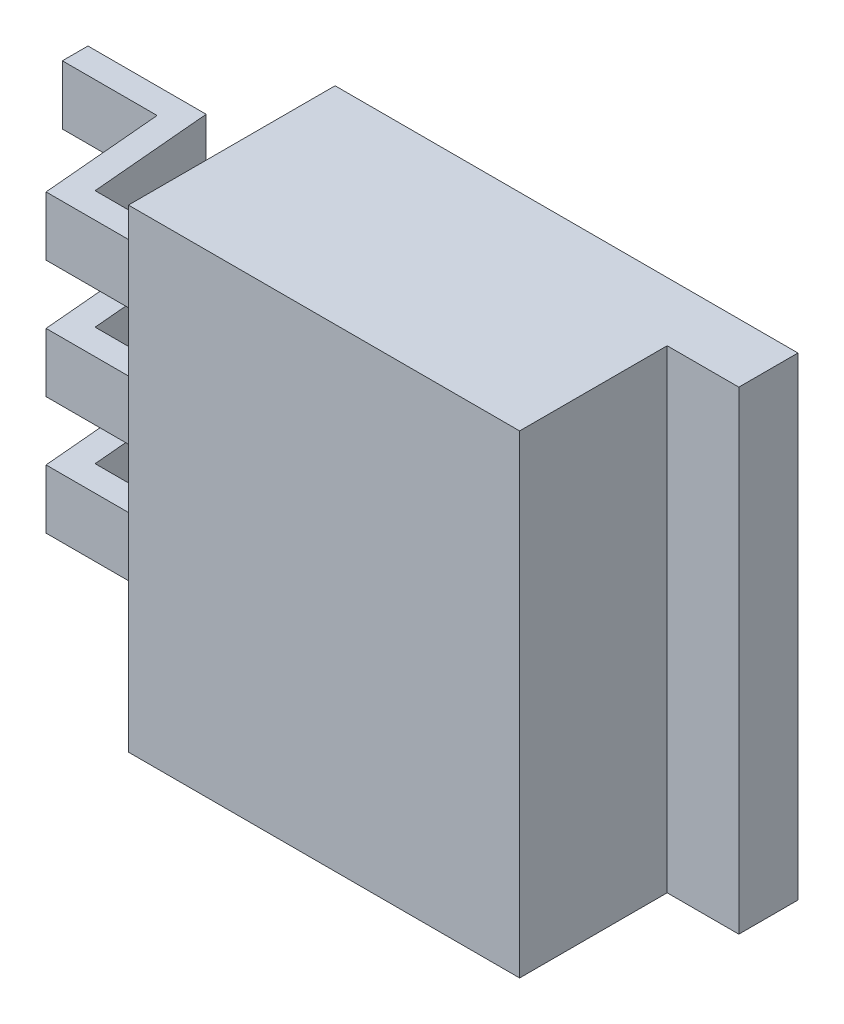
ISO-10303-21;
HEADER;
FILE_DESCRIPTION(('STEP AP214'),'2;1');
FILE_NAME('part.step','',(''),(''),'','','');
FILE_SCHEMA(('AUTOMOTIVE_DESIGN { 1 0 10303 214 1 1 1 1 }'));
ENDSEC;
DATA;
#1=APPLICATION_CONTEXT('core data for automotive mechanical design processes');
#2=APPLICATION_PROTOCOL_DEFINITION('international standard','automotive_design',2000,#1);
#3=PRODUCT_CONTEXT('',#1,'mechanical');
#4=PRODUCT('Part','Part','',(#3));
#5=PRODUCT_RELATED_PRODUCT_CATEGORY('part','',(#4));
#6=PRODUCT_DEFINITION_FORMATION('','',#4);
#7=PRODUCT_DEFINITION_CONTEXT('part definition',#1,'design');
#8=PRODUCT_DEFINITION('design','',#6,#7);
#9=PRODUCT_DEFINITION_SHAPE('','',#8);
#10=(LENGTH_UNIT() NAMED_UNIT(*) SI_UNIT(.MILLI.,.METRE.));
#11=(NAMED_UNIT(*) PLANE_ANGLE_UNIT() SI_UNIT($,.RADIAN.));
#12=(NAMED_UNIT(*) SI_UNIT($,.STERADIAN.) SOLID_ANGLE_UNIT());
#13=UNCERTAINTY_MEASURE_WITH_UNIT(LENGTH_MEASURE(1.E-05),#10,'distance_accuracy_value','');
#14=(GEOMETRIC_REPRESENTATION_CONTEXT(3) GLOBAL_UNCERTAINTY_ASSIGNED_CONTEXT((#13)) GLOBAL_UNIT_ASSIGNED_CONTEXT((#10,
#11,#12)) REPRESENTATION_CONTEXT('',''));
#15=CARTESIAN_POINT('',(0.,0.,0.));
#16=DIRECTION('',(0.,0.,1.));
#17=DIRECTION('',(1.,0.,0.));
#18=AXIS2_PLACEMENT_3D('',#15,#16,#17);
#19=CARTESIAN_POINT('',(-5.358123633487,3.2004,3.2173));
#20=DIRECTION('',(-0.996194698091749,0.,0.0871557427476207));
#21=DIRECTION('',(-0.0871557427476207,0.,-0.996194698091749));
#22=AXIS2_PLACEMENT_3D('',#19,#20,#21);
#23=PLANE('',#22);
#24=DIRECTION('',(-0.0871557427476207,0.,-0.996194698091749));
#25=VECTOR('',#24,1.);
#26=CARTESIAN_POINT('',(-5.358123633487,1.905,3.2173));
#27=LINE('',#26,#25);
#28=CARTESIAN_POINT('',(-5.5914821457098,1.905,0.55));
#29=VERTEX_POINT('',#28);
#30=CARTESIAN_POINT('',(-5.3626992905894,1.905,3.16500000000002));
#31=VERTEX_POINT('',#30);
#32=EDGE_CURVE('E367',#29,#31,#27,.F.);
#33=ORIENTED_EDGE('',*,*,#32,.T.);
#34=DIRECTION('',(0.,1.,0.));
#35=VECTOR('',#34,1.);
#36=CARTESIAN_POINT('',(-5.3626992905894,2.54,3.16500000000004));
#37=LINE('',#36,#35);
#38=CARTESIAN_POINT('',(-5.3626992905894,3.175,3.16500000000002));
#39=VERTEX_POINT('',#38);
#40=EDGE_CURVE('E381',#39,#31,#37,.F.);
#41=ORIENTED_EDGE('',*,*,#40,.F.);
#42=DIRECTION('',(-0.0871557427476207,0.,-0.996194698091749));
#43=VECTOR('',#42,1.);
#44=CARTESIAN_POINT('',(-5.358123633487,3.175,3.2173));
#45=LINE('',#44,#43);
#46=CARTESIAN_POINT('',(-5.5914821457098,3.175,0.55));
#47=VERTEX_POINT('',#46);
#48=EDGE_CURVE('E262',#39,#47,#45,.T.);
#49=ORIENTED_EDGE('',*,*,#48,.T.);
#50=DIRECTION('',(0.,1.,0.));
#51=VECTOR('',#50,1.);
#52=CARTESIAN_POINT('',(-5.59148214571,2.54,0.55));
#53=LINE('',#52,#51);
#54=EDGE_CURVE('E379',#47,#29,#53,.F.);
#55=ORIENTED_EDGE('',*,*,#54,.T.);
#56=EDGE_LOOP('',(#33,#41,#49,#55));
#57=FACE_BOUND('',#56,.T.);
#58=ADVANCED_FACE('F15',(#57),#23,.T.);
#59=CARTESIAN_POINT('',(-5.550761788624,3.2004,0.55));
#60=DIRECTION('',(0.,0.,1.));
#61=DIRECTION('',(-1.,0.,0.));
#62=AXIS2_PLACEMENT_3D('',#59,#60,#61);
#63=PLANE('',#62);
#64=DIRECTION('',(-1.,0.,0.));
#65=VECTOR('',#64,1.);
#66=CARTESIAN_POINT('',(-4.9725,1.905,0.55));
#67=LINE('',#66,#65);
#68=CARTESIAN_POINT('',(-7.6275,1.905,0.55));
#69=VERTEX_POINT('',#68);
#70=EDGE_CURVE('E369',#69,#29,#67,.F.);
#71=ORIENTED_EDGE('',*,*,#70,.T.);
#72=ORIENTED_EDGE('',*,*,#54,.F.);
#73=DIRECTION('',(-1.,0.,0.));
#74=VECTOR('',#73,1.);
#75=CARTESIAN_POINT('',(-4.9725,3.175,0.55));
#76=LINE('',#75,#74);
#77=CARTESIAN_POINT('',(-7.6275,3.175,0.55));
#78=VERTEX_POINT('',#77);
#79=EDGE_CURVE('E259',#47,#78,#76,.T.);
#80=ORIENTED_EDGE('',*,*,#79,.T.);
#81=DIRECTION('',(0.,1.,0.));
#82=VECTOR('',#81,1.);
#83=CARTESIAN_POINT('',(-7.6275,2.54,0.55));
#84=LINE('',#83,#82);
#85=EDGE_CURVE('E422',#78,#69,#84,.F.);
#86=ORIENTED_EDGE('',*,*,#85,.T.);
#87=EDGE_LOOP('',(#71,#72,#80,#86));
#88=FACE_BOUND('',#87,.T.);
#89=ADVANCED_FACE('F766',(#88),#63,.T.);
#90=CARTESIAN_POINT('',(-7.6275,3.2004,0.5726434952249));
#91=DIRECTION('',(-1.,0.,0.));
#92=DIRECTION('',(0.,0.,-1.));
#93=AXIS2_PLACEMENT_3D('',#90,#91,#92);
#94=PLANE('',#93);
#95=DIRECTION('',(0.,0.,-1.));
#96=VECTOR('',#95,1.);
#97=CARTESIAN_POINT('',(-7.6275,1.905,1.5825));
#98=LINE('',#97,#96);
#99=CARTESIAN_POINT('',(-7.6275,1.905,0.));
#100=VERTEX_POINT('',#99);
#101=EDGE_CURVE('E234',#100,#69,#98,.F.);
#102=ORIENTED_EDGE('',*,*,#101,.T.);
#103=ORIENTED_EDGE('',*,*,#85,.F.);
#104=DIRECTION('',(0.,0.,-1.));
#105=VECTOR('',#104,1.);
#106=CARTESIAN_POINT('',(-7.6275,3.175,1.5825));
#107=LINE('',#106,#105);
#108=CARTESIAN_POINT('',(-7.6275,3.175,0.));
#109=VERTEX_POINT('',#108);
#110=EDGE_CURVE('E249',#78,#109,#107,.T.);
#111=ORIENTED_EDGE('',*,*,#110,.T.);
#112=DIRECTION('',(0.,1.,0.));
#113=VECTOR('',#112,1.);
#114=CARTESIAN_POINT('',(-7.6275,2.54,0.));
#115=LINE('',#114,#113);
#116=EDGE_CURVE('E224',#109,#100,#115,.F.);
#117=ORIENTED_EDGE('',*,*,#116,.T.);
#118=EDGE_LOOP('',(#102,#103,#111,#117));
#119=FACE_BOUND('',#118,.T.);
#120=ADVANCED_FACE('F426',(#119),#94,.T.);
#121=CARTESIAN_POINT('',(-7.6783,3.2004,0.));
#122=DIRECTION('',(0.,0.,-1.));
#123=DIRECTION('',(1.,0.,0.));
#124=AXIS2_PLACEMENT_3D('',#121,#122,#123);
#125=PLANE('',#124);
#126=DIRECTION('',(1.,0.,0.));
#127=VECTOR('',#126,1.);
#128=CARTESIAN_POINT('',(-4.9725,1.905,0.));
#129=LINE('',#128,#127);
#130=CARTESIAN_POINT('',(-5.0874999999996,1.905,0.));
#131=VERTEX_POINT('',#130);
#132=EDGE_CURVE('E219',#131,#100,#129,.F.);
#133=ORIENTED_EDGE('',*,*,#132,.T.);
#134=ORIENTED_EDGE('',*,*,#116,.F.);
#135=DIRECTION('',(1.,0.,0.));
#136=VECTOR('',#135,1.);
#137=CARTESIAN_POINT('',(-4.9725,3.175,0.));
#138=LINE('',#137,#136);
#139=CARTESIAN_POINT('',(-5.0874999999996,3.175,0.));
#140=VERTEX_POINT('',#139);
#141=EDGE_CURVE('E221',#109,#140,#138,.T.);
#142=ORIENTED_EDGE('',*,*,#141,.T.);
#143=DIRECTION('',(0.,1.,0.));
#144=VECTOR('',#143,1.);
#145=CARTESIAN_POINT('',(-5.0874999999996,2.54,0.));
#146=LINE('',#145,#144);
#147=EDGE_CURVE('E216',#140,#131,#146,.F.);
#148=ORIENTED_EDGE('',*,*,#147,.T.);
#149=EDGE_LOOP('',(#133,#134,#142,#148));
#150=FACE_BOUND('',#149,.T.);
#151=ADVANCED_FACE('F218',(#150),#125,.T.);
#152=CARTESIAN_POINT('',(-5.092075657102,3.2004,-0.0523));
#153=DIRECTION('',(0.996194698091749,0.,-0.0871557427476207));
#154=DIRECTION('',(0.0871557427476207,0.,0.996194698091749));
#155=AXIS2_PLACEMENT_3D('',#152,#153,#154);
#156=PLANE('',#155);
#157=DIRECTION('',(0.0871557427476207,0.,0.996194698091749));
#158=VECTOR('',#157,1.);
#159=CARTESIAN_POINT('',(-5.092075657102,1.905,-0.0523));
#160=LINE('',#159,#158);
#161=CARTESIAN_POINT('',(-4.8587171448797,1.905,2.615));
#162=VERTEX_POINT('',#161);
#163=EDGE_CURVE('E19',#162,#131,#160,.F.);
#164=ORIENTED_EDGE('',*,*,#163,.T.);
#165=ORIENTED_EDGE('',*,*,#147,.F.);
#166=DIRECTION('',(0.0871557427476207,0.,0.996194698091749));
#167=VECTOR('',#166,1.);
#168=CARTESIAN_POINT('',(-5.092075657102,3.175,-0.0523));
#169=LINE('',#168,#167);
#170=CARTESIAN_POINT('',(-4.8587171448797,3.175,2.615));
#171=VERTEX_POINT('',#170);
#172=EDGE_CURVE('E248',#140,#171,#169,.T.);
#173=ORIENTED_EDGE('',*,*,#172,.T.);
#174=DIRECTION('',(0.,1.,0.));
#175=VECTOR('',#174,1.);
#176=CARTESIAN_POINT('',(-4.85871714488,2.54,2.615));
#177=LINE('',#176,#175);
#178=EDGE_CURVE('E210',#171,#162,#177,.F.);
#179=ORIENTED_EDGE('',*,*,#178,.T.);
#180=EDGE_LOOP('',(#164,#165,#173,#179));
#181=FACE_BOUND('',#180,.T.);
#182=ADVANCED_FACE('F236',(#181),#156,.T.);
#183=CARTESIAN_POINT('',(-4.909541487777,3.2004,2.615));
#184=DIRECTION('',(0.,0.,-1.));
#185=DIRECTION('',(1.,0.,0.));
#186=AXIS2_PLACEMENT_3D('',#183,#184,#185);
#187=PLANE('',#186);
#188=ORIENTED_EDGE('',*,*,#178,.F.);
#189=DIRECTION('',(1.,0.,0.));
#190=VECTOR('',#189,1.);
#191=CARTESIAN_POINT('',(-4.9725,3.175,2.615));
#192=LINE('',#191,#190);
#193=CARTESIAN_POINT('',(-2.3175,3.175,2.615));
#194=VERTEX_POINT('',#193);
#195=EDGE_CURVE('E250',#171,#194,#192,.T.);
#196=ORIENTED_EDGE('',*,*,#195,.T.);
#197=DIRECTION('',(0.,-1.,0.));
#198=VECTOR('',#197,1.);
#199=CARTESIAN_POINT('',(-2.3175,2.54,2.615));
#200=LINE('',#199,#198);
#201=CARTESIAN_POINT('',(-2.3175,1.905,2.615));
#202=VERTEX_POINT('',#201);
#203=EDGE_CURVE('E223',#202,#194,#200,.F.);
#204=ORIENTED_EDGE('',*,*,#203,.F.);
#205=DIRECTION('',(1.,0.,0.));
#206=VECTOR('',#205,1.);
#207=CARTESIAN_POINT('',(-4.9725,1.905,2.615));
#208=LINE('',#207,#206);
#209=EDGE_CURVE('E237',#202,#162,#208,.F.);
#210=ORIENTED_EDGE('',*,*,#209,.T.);
#211=EDGE_LOOP('',(#188,#196,#204,#210));
#212=FACE_BOUND('',#211,.T.);
#213=ADVANCED_FACE('F431',(#212),#187,.T.);
#214=CARTESIAN_POINT('',(-5.358123633487,0.6604,3.2173));
#215=DIRECTION('',(-0.996194698091749,0.,0.0871557427476207));
#216=DIRECTION('',(-0.0871557427476207,0.,-0.996194698091749));
#217=AXIS2_PLACEMENT_3D('',#214,#215,#216);
#218=PLANE('',#217);
#219=DIRECTION('',(-0.0871557427476207,0.,-0.996194698091749));
#220=VECTOR('',#219,1.);
#221=CARTESIAN_POINT('',(-5.358123633487,-0.635000000000001,3.2173));
#222=LINE('',#221,#220);
#223=CARTESIAN_POINT('',(-5.5914821457098,-0.635,0.55));
#224=VERTEX_POINT('',#223);
#225=CARTESIAN_POINT('',(-5.3626992905894,-0.635,3.16500000000002));
#226=VERTEX_POINT('',#225);
#227=EDGE_CURVE('E270',#224,#226,#222,.F.);
#228=ORIENTED_EDGE('',*,*,#227,.T.);
#229=DIRECTION('',(0.,1.,0.));
#230=VECTOR('',#229,1.);
#231=CARTESIAN_POINT('',(-5.3626992905894,0.,3.16500000000004));
#232=LINE('',#231,#230);
#233=CARTESIAN_POINT('',(-5.3626992905894,0.635,3.16500000000002));
#234=VERTEX_POINT('',#233);
#235=EDGE_CURVE('E266',#234,#226,#232,.F.);
#236=ORIENTED_EDGE('',*,*,#235,.F.);
#237=DIRECTION('',(-0.0871557427476207,0.,-0.996194698091749));
#238=VECTOR('',#237,1.);
#239=CARTESIAN_POINT('',(-5.358123633487,0.635,3.2173));
#240=LINE('',#239,#238);
#241=CARTESIAN_POINT('',(-5.5914821457098,0.635,0.55));
#242=VERTEX_POINT('',#241);
#243=EDGE_CURVE('E305',#234,#242,#240,.T.);
#244=ORIENTED_EDGE('',*,*,#243,.T.);
#245=DIRECTION('',(0.,1.,0.));
#246=VECTOR('',#245,1.);
#247=CARTESIAN_POINT('',(-5.59148214571,0.,0.55));
#248=LINE('',#247,#246);
#249=EDGE_CURVE('E263',#242,#224,#248,.F.);
#250=ORIENTED_EDGE('',*,*,#249,.T.);
#251=EDGE_LOOP('',(#228,#236,#244,#250));
#252=FACE_BOUND('',#251,.T.);
#253=ADVANCED_FACE('F733',(#252),#218,.T.);
#254=CARTESIAN_POINT('',(-5.550761788624,0.6604,0.55));
#255=DIRECTION('',(0.,0.,1.));
#256=DIRECTION('',(-1.,0.,0.));
#257=AXIS2_PLACEMENT_3D('',#254,#255,#256);
#258=PLANE('',#257);
#259=DIRECTION('',(-1.,0.,0.));
#260=VECTOR('',#259,1.);
#261=CARTESIAN_POINT('',(-4.9725,-0.635,0.55));
#262=LINE('',#261,#260);
#263=CARTESIAN_POINT('',(-7.6275,-0.635,0.55));
#264=VERTEX_POINT('',#263);
#265=EDGE_CURVE('E267',#264,#224,#262,.F.);
#266=ORIENTED_EDGE('',*,*,#265,.T.);
#267=ORIENTED_EDGE('',*,*,#249,.F.);
#268=DIRECTION('',(-1.,0.,0.));
#269=VECTOR('',#268,1.);
#270=CARTESIAN_POINT('',(-4.9725,0.635,0.55));
#271=LINE('',#270,#269);
#272=CARTESIAN_POINT('',(-7.6275,0.635,0.55));
#273=VERTEX_POINT('',#272);
#274=EDGE_CURVE('E302',#242,#273,#271,.T.);
#275=ORIENTED_EDGE('',*,*,#274,.T.);
#276=DIRECTION('',(0.,1.,0.));
#277=VECTOR('',#276,1.);
#278=CARTESIAN_POINT('',(-7.6275,0.,0.55));
#279=LINE('',#278,#277);
#280=EDGE_CURVE('E265',#273,#264,#279,.F.);
#281=ORIENTED_EDGE('',*,*,#280,.T.);
#282=EDGE_LOOP('',(#266,#267,#275,#281));
#283=FACE_BOUND('',#282,.T.);
#284=ADVANCED_FACE('F725',(#283),#258,.T.);
#285=CARTESIAN_POINT('',(-7.6275,0.6604,0.5726434952249));
#286=DIRECTION('',(-1.,0.,0.));
#287=DIRECTION('',(0.,0.,-1.));
#288=AXIS2_PLACEMENT_3D('',#285,#286,#287);
#289=PLANE('',#288);
#290=DIRECTION('',(0.,0.,-1.));
#291=VECTOR('',#290,1.);
#292=CARTESIAN_POINT('',(-7.6275,-0.635,1.5825));
#293=LINE('',#292,#291);
#294=CARTESIAN_POINT('',(-7.6275,-0.635,0.));
#295=VERTEX_POINT('',#294);
#296=EDGE_CURVE('E271',#295,#264,#293,.F.);
#297=ORIENTED_EDGE('',*,*,#296,.T.);
#298=ORIENTED_EDGE('',*,*,#280,.F.);
#299=DIRECTION('',(0.,0.,-1.));
#300=VECTOR('',#299,1.);
#301=CARTESIAN_POINT('',(-7.6275,0.635,1.5825));
#302=LINE('',#301,#300);
#303=CARTESIAN_POINT('',(-7.6275,0.635,0.));
#304=VERTEX_POINT('',#303);
#305=EDGE_CURVE('E294',#273,#304,#302,.T.);
#306=ORIENTED_EDGE('',*,*,#305,.T.);
#307=DIRECTION('',(0.,1.,0.));
#308=VECTOR('',#307,1.);
#309=CARTESIAN_POINT('',(-7.6275,0.,0.));
#310=LINE('',#309,#308);
#311=EDGE_CURVE('E286',#304,#295,#310,.F.);
#312=ORIENTED_EDGE('',*,*,#311,.T.);
#313=EDGE_LOOP('',(#297,#298,#306,#312));
#314=FACE_BOUND('',#313,.T.);
#315=ADVANCED_FACE('F717',(#314),#289,.T.);
#316=CARTESIAN_POINT('',(-7.6783,0.6604,0.));
#317=DIRECTION('',(0.,0.,-1.));
#318=DIRECTION('',(1.,0.,0.));
#319=AXIS2_PLACEMENT_3D('',#316,#317,#318);
#320=PLANE('',#319);
#321=DIRECTION('',(1.,0.,0.));
#322=VECTOR('',#321,1.);
#323=CARTESIAN_POINT('',(-4.9725,-0.635,0.));
#324=LINE('',#323,#322);
#325=CARTESIAN_POINT('',(-5.0874999999996,-0.635,0.));
#326=VERTEX_POINT('',#325);
#327=EDGE_CURVE('E287',#326,#295,#324,.F.);
#328=ORIENTED_EDGE('',*,*,#327,.T.);
#329=ORIENTED_EDGE('',*,*,#311,.F.);
#330=DIRECTION('',(1.,0.,0.));
#331=VECTOR('',#330,1.);
#332=CARTESIAN_POINT('',(-4.9725,0.635,0.));
#333=LINE('',#332,#331);
#334=CARTESIAN_POINT('',(-5.0874999999996,0.635,0.));
#335=VERTEX_POINT('',#334);
#336=EDGE_CURVE('E290',#304,#335,#333,.T.);
#337=ORIENTED_EDGE('',*,*,#336,.T.);
#338=DIRECTION('',(0.,1.,0.));
#339=VECTOR('',#338,1.);
#340=CARTESIAN_POINT('',(-5.0874999999996,0.,0.));
#341=LINE('',#340,#339);
#342=EDGE_CURVE('E284',#335,#326,#341,.F.);
#343=ORIENTED_EDGE('',*,*,#342,.T.);
#344=EDGE_LOOP('',(#328,#329,#337,#343));
#345=FACE_BOUND('',#344,.T.);
#346=ADVANCED_FACE('F709',(#345),#320,.T.);
#347=CARTESIAN_POINT('',(-5.092075657102,0.6604,-0.0523));
#348=DIRECTION('',(0.996194698091749,0.,-0.0871557427476207));
#349=DIRECTION('',(0.0871557427476207,0.,0.996194698091749));
#350=AXIS2_PLACEMENT_3D('',#347,#348,#349);
#351=PLANE('',#350);
#352=DIRECTION('',(0.0871557427476207,0.,0.996194698091749));
#353=VECTOR('',#352,1.);
#354=CARTESIAN_POINT('',(-5.092075657102,-0.635000000000001,-0.0523));
#355=LINE('',#354,#353);
#356=CARTESIAN_POINT('',(-4.8587171448797,-0.635,2.615));
#357=VERTEX_POINT('',#356);
#358=EDGE_CURVE('E283',#357,#326,#355,.F.);
#359=ORIENTED_EDGE('',*,*,#358,.T.);
#360=ORIENTED_EDGE('',*,*,#342,.F.);
#361=DIRECTION('',(0.0871557427476207,0.,0.996194698091749));
#362=VECTOR('',#361,1.);
#363=CARTESIAN_POINT('',(-5.092075657102,0.635,-0.0523));
#364=LINE('',#363,#362);
#365=CARTESIAN_POINT('',(-4.8587171448797,0.635,2.615));
#366=VERTEX_POINT('',#365);
#367=EDGE_CURVE('E293',#335,#366,#364,.T.);
#368=ORIENTED_EDGE('',*,*,#367,.T.);
#369=DIRECTION('',(0.,1.,0.));
#370=VECTOR('',#369,1.);
#371=CARTESIAN_POINT('',(-4.85871714488,0.,2.615));
#372=LINE('',#371,#370);
#373=EDGE_CURVE('E276',#366,#357,#372,.F.);
#374=ORIENTED_EDGE('',*,*,#373,.T.);
#375=EDGE_LOOP('',(#359,#360,#368,#374));
#376=FACE_BOUND('',#375,.T.);
#377=ADVANCED_FACE('F701',(#376),#351,.T.);
#378=CARTESIAN_POINT('',(-4.909541487777,0.6604,2.615));
#379=DIRECTION('',(0.,0.,-1.));
#380=DIRECTION('',(1.,0.,0.));
#381=AXIS2_PLACEMENT_3D('',#378,#379,#380);
#382=PLANE('',#381);
#383=ORIENTED_EDGE('',*,*,#373,.F.);
#384=DIRECTION('',(1.,0.,0.));
#385=VECTOR('',#384,1.);
#386=CARTESIAN_POINT('',(-4.9725,0.635,2.615));
#387=LINE('',#386,#385);
#388=CARTESIAN_POINT('',(-2.3175,0.635,2.615));
#389=VERTEX_POINT('',#388);
#390=EDGE_CURVE('E295',#366,#389,#387,.T.);
#391=ORIENTED_EDGE('',*,*,#390,.T.);
#392=DIRECTION('',(0.,-1.,0.));
#393=VECTOR('',#392,1.);
#394=CARTESIAN_POINT('',(-2.3175,0.,2.615));
#395=LINE('',#394,#393);
#396=CARTESIAN_POINT('',(-2.3175,-0.634999999999999,2.615));
#397=VERTEX_POINT('',#396);
#398=EDGE_CURVE('E279',#397,#389,#395,.F.);
#399=ORIENTED_EDGE('',*,*,#398,.F.);
#400=DIRECTION('',(1.,0.,0.));
#401=VECTOR('',#400,1.);
#402=CARTESIAN_POINT('',(-4.9725,-0.635,2.615));
#403=LINE('',#402,#401);
#404=EDGE_CURVE('E280',#397,#357,#403,.F.);
#405=ORIENTED_EDGE('',*,*,#404,.T.);
#406=EDGE_LOOP('',(#383,#391,#399,#405));
#407=FACE_BOUND('',#406,.T.);
#408=ADVANCED_FACE('F534',(#407),#382,.T.);
#409=CARTESIAN_POINT('',(-5.358123633487,-1.8796,3.2173));
#410=DIRECTION('',(-0.996194698091749,0.,0.0871557427476207));
#411=DIRECTION('',(-0.0871557427476207,0.,-0.996194698091749));
#412=AXIS2_PLACEMENT_3D('',#409,#410,#411);
#413=PLANE('',#412);
#414=DIRECTION('',(-0.0871557427476207,0.,-0.996194698091749));
#415=VECTOR('',#414,1.);
#416=CARTESIAN_POINT('',(-5.358123633487,-3.175,3.2173));
#417=LINE('',#416,#415);
#418=CARTESIAN_POINT('',(-5.5914821457098,-3.175,0.55));
#419=VERTEX_POINT('',#418);
#420=CARTESIAN_POINT('',(-5.3626992905894,-3.175,3.16500000000002));
#421=VERTEX_POINT('',#420);
#422=EDGE_CURVE('E312',#419,#421,#417,.F.);
#423=ORIENTED_EDGE('',*,*,#422,.T.);
#424=DIRECTION('',(0.,1.,0.));
#425=VECTOR('',#424,1.);
#426=CARTESIAN_POINT('',(-5.3626992905894,-2.54,3.16500000000004));
#427=LINE('',#426,#425);
#428=CARTESIAN_POINT('',(-5.3626992905894,-1.905,3.16500000000002));
#429=VERTEX_POINT('',#428);
#430=EDGE_CURVE('E278',#429,#421,#427,.F.);
#431=ORIENTED_EDGE('',*,*,#430,.F.);
#432=DIRECTION('',(-0.0871557427476207,0.,-0.996194698091749));
#433=VECTOR('',#432,1.);
#434=CARTESIAN_POINT('',(-5.358123633487,-1.905,3.2173));
#435=LINE('',#434,#433);
#436=CARTESIAN_POINT('',(-5.5914821457098,-1.905,0.55));
#437=VERTEX_POINT('',#436);
#438=EDGE_CURVE('E345',#429,#437,#435,.T.);
#439=ORIENTED_EDGE('',*,*,#438,.T.);
#440=DIRECTION('',(0.,1.,0.));
#441=VECTOR('',#440,1.);
#442=CARTESIAN_POINT('',(-5.59148214571,-2.54,0.55));
#443=LINE('',#442,#441);
#444=EDGE_CURVE('E306',#437,#419,#443,.F.);
#445=ORIENTED_EDGE('',*,*,#444,.T.);
#446=EDGE_LOOP('',(#423,#431,#439,#445));
#447=FACE_BOUND('',#446,.T.);
#448=ADVANCED_FACE('F506',(#447),#413,.T.);
#449=CARTESIAN_POINT('',(-5.550761788624,-1.8796,0.55));
#450=DIRECTION('',(0.,0.,1.));
#451=DIRECTION('',(-1.,0.,0.));
#452=AXIS2_PLACEMENT_3D('',#449,#450,#451);
#453=PLANE('',#452);
#454=DIRECTION('',(-1.,0.,0.));
#455=VECTOR('',#454,1.);
#456=CARTESIAN_POINT('',(-4.9725,-3.175,0.55));
#457=LINE('',#456,#455);
#458=CARTESIAN_POINT('',(-7.6275,-3.175,0.55));
#459=VERTEX_POINT('',#458);
#460=EDGE_CURVE('E309',#459,#419,#457,.F.);
#461=ORIENTED_EDGE('',*,*,#460,.T.);
#462=ORIENTED_EDGE('',*,*,#444,.F.);
#463=DIRECTION('',(-1.,0.,0.));
#464=VECTOR('',#463,1.);
#465=CARTESIAN_POINT('',(-4.9725,-1.905,0.55));
#466=LINE('',#465,#464);
#467=CARTESIAN_POINT('',(-7.6275,-1.905,0.55));
#468=VERTEX_POINT('',#467);
#469=EDGE_CURVE('E342',#437,#468,#466,.T.);
#470=ORIENTED_EDGE('',*,*,#469,.T.);
#471=DIRECTION('',(0.,1.,0.));
#472=VECTOR('',#471,1.);
#473=CARTESIAN_POINT('',(-7.6275,-2.54,0.55));
#474=LINE('',#473,#472);
#475=EDGE_CURVE('E308',#468,#459,#474,.F.);
#476=ORIENTED_EDGE('',*,*,#475,.T.);
#477=EDGE_LOOP('',(#461,#462,#470,#476));
#478=FACE_BOUND('',#477,.T.);
#479=ADVANCED_FACE('F525',(#478),#453,.T.);
#480=CARTESIAN_POINT('',(-7.6275,-1.8796,0.5726434952249));
#481=DIRECTION('',(-1.,0.,0.));
#482=DIRECTION('',(0.,0.,-1.));
#483=AXIS2_PLACEMENT_3D('',#480,#481,#482);
#484=PLANE('',#483);
#485=DIRECTION('',(0.,0.,-1.));
#486=VECTOR('',#485,1.);
#487=CARTESIAN_POINT('',(-7.6275,-3.175,1.5825));
#488=LINE('',#487,#486);
#489=CARTESIAN_POINT('',(-7.6275,-3.175,0.));
#490=VERTEX_POINT('',#489);
#491=EDGE_CURVE('E313',#490,#459,#488,.F.);
#492=ORIENTED_EDGE('',*,*,#491,.T.);
#493=ORIENTED_EDGE('',*,*,#475,.F.);
#494=DIRECTION('',(0.,0.,-1.));
#495=VECTOR('',#494,1.);
#496=CARTESIAN_POINT('',(-7.6275,-1.905,1.5825));
#497=LINE('',#496,#495);
#498=CARTESIAN_POINT('',(-7.6275,-1.905,0.));
#499=VERTEX_POINT('',#498);
#500=EDGE_CURVE('E334',#468,#499,#497,.T.);
#501=ORIENTED_EDGE('',*,*,#500,.T.);
#502=DIRECTION('',(0.,1.,0.));
#503=VECTOR('',#502,1.);
#504=CARTESIAN_POINT('',(-7.6275,-2.54,0.));
#505=LINE('',#504,#503);
#506=EDGE_CURVE('E326',#499,#490,#505,.F.);
#507=ORIENTED_EDGE('',*,*,#506,.T.);
#508=EDGE_LOOP('',(#492,#493,#501,#507));
#509=FACE_BOUND('',#508,.T.);
#510=ADVANCED_FACE('F523',(#509),#484,.T.);
#511=CARTESIAN_POINT('',(-7.6783,-1.8796,0.));
#512=DIRECTION('',(0.,0.,-1.));
#513=DIRECTION('',(1.,0.,0.));
#514=AXIS2_PLACEMENT_3D('',#511,#512,#513);
#515=PLANE('',#514);
#516=DIRECTION('',(1.,0.,0.));
#517=VECTOR('',#516,1.);
#518=CARTESIAN_POINT('',(-4.9725,-3.175,0.));
#519=LINE('',#518,#517);
#520=CARTESIAN_POINT('',(-5.0874999999996,-3.175,0.));
#521=VERTEX_POINT('',#520);
#522=EDGE_CURVE('E327',#521,#490,#519,.F.);
#523=ORIENTED_EDGE('',*,*,#522,.T.);
#524=ORIENTED_EDGE('',*,*,#506,.F.);
#525=DIRECTION('',(1.,0.,0.));
#526=VECTOR('',#525,1.);
#527=CARTESIAN_POINT('',(-4.9725,-1.905,0.));
#528=LINE('',#527,#526);
#529=CARTESIAN_POINT('',(-5.0874999999996,-1.905,0.));
#530=VERTEX_POINT('',#529);
#531=EDGE_CURVE('E330',#499,#530,#528,.T.);
#532=ORIENTED_EDGE('',*,*,#531,.T.);
#533=DIRECTION('',(0.,1.,0.));
#534=VECTOR('',#533,1.);
#535=CARTESIAN_POINT('',(-5.0874999999996,-2.54,0.));
#536=LINE('',#535,#534);
#537=EDGE_CURVE('E324',#530,#521,#536,.F.);
#538=ORIENTED_EDGE('',*,*,#537,.T.);
#539=EDGE_LOOP('',(#523,#524,#532,#538));
#540=FACE_BOUND('',#539,.T.);
#541=ADVANCED_FACE('F520',(#540),#515,.T.);
#542=CARTESIAN_POINT('',(-5.092075657102,-1.8796,-0.0523));
#543=DIRECTION('',(0.996194698091749,0.,-0.0871557427476207));
#544=DIRECTION('',(0.0871557427476207,0.,0.996194698091749));
#545=AXIS2_PLACEMENT_3D('',#542,#543,#544);
#546=PLANE('',#545);
#547=DIRECTION('',(0.0871557427476207,0.,0.996194698091749));
#548=VECTOR('',#547,1.);
#549=CARTESIAN_POINT('',(-5.092075657102,-3.175,-0.0523));
#550=LINE('',#549,#548);
#551=CARTESIAN_POINT('',(-4.8587171448797,-3.175,2.615));
#552=VERTEX_POINT('',#551);
#553=EDGE_CURVE('E323',#552,#521,#550,.F.);
#554=ORIENTED_EDGE('',*,*,#553,.T.);
#555=ORIENTED_EDGE('',*,*,#537,.F.);
#556=DIRECTION('',(0.0871557427476207,0.,0.996194698091749));
#557=VECTOR('',#556,1.);
#558=CARTESIAN_POINT('',(-5.092075657102,-1.905,-0.0523));
#559=LINE('',#558,#557);
#560=CARTESIAN_POINT('',(-4.8587171448797,-1.905,2.615));
#561=VERTEX_POINT('',#560);
#562=EDGE_CURVE('E333',#530,#561,#559,.T.);
#563=ORIENTED_EDGE('',*,*,#562,.T.);
#564=DIRECTION('',(0.,1.,0.));
#565=VECTOR('',#564,1.);
#566=CARTESIAN_POINT('',(-4.85871714488,-2.54,2.615));
#567=LINE('',#566,#565);
#568=EDGE_CURVE('E242',#561,#552,#567,.F.);
#569=ORIENTED_EDGE('',*,*,#568,.T.);
#570=EDGE_LOOP('',(#554,#555,#563,#569));
#571=FACE_BOUND('',#570,.T.);
#572=ADVANCED_FACE('F518',(#571),#546,.T.);
#573=CARTESIAN_POINT('',(-4.909541487777,-1.8796,2.615));
#574=DIRECTION('',(0.,0.,-1.));
#575=DIRECTION('',(1.,0.,0.));
#576=AXIS2_PLACEMENT_3D('',#573,#574,#575);
#577=PLANE('',#576);
#578=ORIENTED_EDGE('',*,*,#568,.F.);
#579=DIRECTION('',(1.,0.,0.));
#580=VECTOR('',#579,1.);
#581=CARTESIAN_POINT('',(-4.9725,-1.905,2.615));
#582=LINE('',#581,#580);
#583=CARTESIAN_POINT('',(-2.3175,-1.905,2.615));
#584=VERTEX_POINT('',#583);
#585=EDGE_CURVE('E335',#561,#584,#582,.T.);
#586=ORIENTED_EDGE('',*,*,#585,.T.);
#587=DIRECTION('',(0.,-1.,0.));
#588=VECTOR('',#587,1.);
#589=CARTESIAN_POINT('',(-2.3175,-2.54,2.615));
#590=LINE('',#589,#588);
#591=CARTESIAN_POINT('',(-2.3175,-3.175,2.615));
#592=VERTEX_POINT('',#591);
#593=EDGE_CURVE('E319',#592,#584,#590,.F.);
#594=ORIENTED_EDGE('',*,*,#593,.F.);
#595=DIRECTION('',(1.,0.,0.));
#596=VECTOR('',#595,1.);
#597=CARTESIAN_POINT('',(-4.9725,-3.175,2.615));
#598=LINE('',#597,#596);
#599=EDGE_CURVE('E320',#592,#552,#598,.F.);
#600=ORIENTED_EDGE('',*,*,#599,.T.);
#601=EDGE_LOOP('',(#578,#586,#594,#600));
#602=FACE_BOUND('',#601,.T.);
#603=ADVANCED_FACE('F515',(#602),#577,.T.);
#604=CARTESIAN_POINT('',(-7.7337,1.905,-0.0633));
#605=DIRECTION('',(0.,-1.,0.));
#606=DIRECTION('',(1.,0.,0.));
#607=AXIS2_PLACEMENT_3D('',#604,#605,#606);
#608=PLANE('',#607);
#609=ORIENTED_EDGE('',*,*,#32,.F.);
#610=ORIENTED_EDGE('',*,*,#70,.F.);
#611=ORIENTED_EDGE('',*,*,#101,.F.);
#612=ORIENTED_EDGE('',*,*,#132,.F.);
#613=ORIENTED_EDGE('',*,*,#163,.F.);
#614=ORIENTED_EDGE('',*,*,#209,.F.);
#615=DIRECTION('',(0.,0.,1.));
#616=VECTOR('',#615,1.);
#617=CARTESIAN_POINT('',(-2.3175,1.905,1.5825));
#618=LINE('',#617,#616);
#619=CARTESIAN_POINT('',(-2.3175,1.905,3.165));
#620=VERTEX_POINT('',#619);
#621=EDGE_CURVE('E238',#620,#202,#618,.F.);
#622=ORIENTED_EDGE('',*,*,#621,.F.);
#623=DIRECTION('',(1.,0.,0.));
#624=VECTOR('',#623,1.);
#625=CARTESIAN_POINT('',(-3.8400996452945,1.905,3.165));
#626=LINE('',#625,#624);
#627=EDGE_CURVE('E258',#620,#31,#626,.F.);
#628=ORIENTED_EDGE('',*,*,#627,.T.);
#629=EDGE_LOOP('',(#609,#610,#611,#612,#613,#614,#622,#628));
#630=FACE_BOUND('',#629,.T.);
#631=ADVANCED_FACE('F229',(#630),#608,.T.);
#632=CARTESIAN_POINT('',(-7.7337,3.175,-0.0633));
#633=DIRECTION('',(0.,-1.,0.));
#634=DIRECTION('',(1.,0.,0.));
#635=AXIS2_PLACEMENT_3D('',#632,#633,#634);
#636=PLANE('',#635);
#637=ORIENTED_EDGE('',*,*,#172,.F.);
#638=ORIENTED_EDGE('',*,*,#141,.F.);
#639=ORIENTED_EDGE('',*,*,#110,.F.);
#640=ORIENTED_EDGE('',*,*,#79,.F.);
#641=ORIENTED_EDGE('',*,*,#48,.F.);
#642=DIRECTION('',(-1.,0.,0.));
#643=VECTOR('',#642,1.);
#644=CARTESIAN_POINT('',(-3.8400996452945,3.175,3.165));
#645=LINE('',#644,#643);
#646=CARTESIAN_POINT('',(-2.3175,3.175,3.165));
#647=VERTEX_POINT('',#646);
#648=EDGE_CURVE('E254',#39,#647,#645,.F.);
#649=ORIENTED_EDGE('',*,*,#648,.T.);
#650=DIRECTION('',(0.,0.,1.));
#651=VECTOR('',#650,1.);
#652=CARTESIAN_POINT('',(-2.3175,3.175,1.5825));
#653=LINE('',#652,#651);
#654=EDGE_CURVE('E366',#194,#647,#653,.T.);
#655=ORIENTED_EDGE('',*,*,#654,.F.);
#656=ORIENTED_EDGE('',*,*,#195,.F.);
#657=EDGE_LOOP('',(#637,#638,#639,#640,#641,#649,#655,#656));
#658=FACE_BOUND('',#657,.T.);
#659=ADVANCED_FACE('F429',(#658),#636,.F.);
#660=CARTESIAN_POINT('',(-7.7337,-0.635,-0.0633));
#661=DIRECTION('',(0.,-1.,0.));
#662=DIRECTION('',(1.,0.,0.));
#663=AXIS2_PLACEMENT_3D('',#660,#661,#662);
#664=PLANE('',#663);
#665=ORIENTED_EDGE('',*,*,#227,.F.);
#666=ORIENTED_EDGE('',*,*,#265,.F.);
#667=ORIENTED_EDGE('',*,*,#296,.F.);
#668=ORIENTED_EDGE('',*,*,#327,.F.);
#669=ORIENTED_EDGE('',*,*,#358,.F.);
#670=ORIENTED_EDGE('',*,*,#404,.F.);
#671=DIRECTION('',(0.,0.,1.));
#672=VECTOR('',#671,1.);
#673=CARTESIAN_POINT('',(-2.3175,-0.635,1.5825));
#674=LINE('',#673,#672);
#675=CARTESIAN_POINT('',(-2.3175,-0.635,3.165));
#676=VERTEX_POINT('',#675);
#677=EDGE_CURVE('E253',#676,#397,#674,.F.);
#678=ORIENTED_EDGE('',*,*,#677,.F.);
#679=DIRECTION('',(1.,0.,0.));
#680=VECTOR('',#679,1.);
#681=CARTESIAN_POINT('',(-3.8400996452945,-0.635,3.165));
#682=LINE('',#681,#680);
#683=EDGE_CURVE('E257',#676,#226,#682,.F.);
#684=ORIENTED_EDGE('',*,*,#683,.T.);
#685=EDGE_LOOP('',(#665,#666,#667,#668,#669,#670,#678,#684));
#686=FACE_BOUND('',#685,.T.);
#687=ADVANCED_FACE('F577',(#686),#664,.T.);
#688=CARTESIAN_POINT('',(-7.7337,0.635,-0.0633));
#689=DIRECTION('',(0.,-1.,0.));
#690=DIRECTION('',(1.,0.,0.));
#691=AXIS2_PLACEMENT_3D('',#688,#689,#690);
#692=PLANE('',#691);
#693=ORIENTED_EDGE('',*,*,#367,.F.);
#694=ORIENTED_EDGE('',*,*,#336,.F.);
#695=ORIENTED_EDGE('',*,*,#305,.F.);
#696=ORIENTED_EDGE('',*,*,#274,.F.);
#697=ORIENTED_EDGE('',*,*,#243,.F.);
#698=DIRECTION('',(-1.,0.,0.));
#699=VECTOR('',#698,1.);
#700=CARTESIAN_POINT('',(-3.8400996452945,0.635,3.165));
#701=LINE('',#700,#699);
#702=CARTESIAN_POINT('',(-2.3175,0.635,3.165));
#703=VERTEX_POINT('',#702);
#704=EDGE_CURVE('E275',#234,#703,#701,.F.);
#705=ORIENTED_EDGE('',*,*,#704,.T.);
#706=DIRECTION('',(0.,0.,1.));
#707=VECTOR('',#706,1.);
#708=CARTESIAN_POINT('',(-2.3175,0.635,1.5825));
#709=LINE('',#708,#707);
#710=EDGE_CURVE('E359',#389,#703,#709,.T.);
#711=ORIENTED_EDGE('',*,*,#710,.F.);
#712=ORIENTED_EDGE('',*,*,#390,.F.);
#713=EDGE_LOOP('',(#693,#694,#695,#696,#697,#705,#711,#712));
#714=FACE_BOUND('',#713,.T.);
#715=ADVANCED_FACE('F574',(#714),#692,.F.);
#716=CARTESIAN_POINT('',(-7.7337,-3.175,-0.0633));
#717=DIRECTION('',(0.,-1.,0.));
#718=DIRECTION('',(1.,0.,0.));
#719=AXIS2_PLACEMENT_3D('',#716,#717,#718);
#720=PLANE('',#719);
#721=ORIENTED_EDGE('',*,*,#422,.F.);
#722=ORIENTED_EDGE('',*,*,#460,.F.);
#723=ORIENTED_EDGE('',*,*,#491,.F.);
#724=ORIENTED_EDGE('',*,*,#522,.F.);
#725=ORIENTED_EDGE('',*,*,#553,.F.);
#726=ORIENTED_EDGE('',*,*,#599,.F.);
#727=DIRECTION('',(0.,0.,1.));
#728=VECTOR('',#727,1.);
#729=CARTESIAN_POINT('',(-2.3175,-3.175,1.5825));
#730=LINE('',#729,#728);
#731=CARTESIAN_POINT('',(-2.3175,-3.175,3.165));
#732=VERTEX_POINT('',#731);
#733=EDGE_CURVE('E298',#732,#592,#730,.F.);
#734=ORIENTED_EDGE('',*,*,#733,.F.);
#735=DIRECTION('',(1.,0.,0.));
#736=VECTOR('',#735,1.);
#737=CARTESIAN_POINT('',(-3.8400996452945,-3.175,3.165));
#738=LINE('',#737,#736);
#739=EDGE_CURVE('E301',#732,#421,#738,.F.);
#740=ORIENTED_EDGE('',*,*,#739,.T.);
#741=EDGE_LOOP('',(#721,#722,#723,#724,#725,#726,#734,#740));
#742=FACE_BOUND('',#741,.T.);
#743=ADVANCED_FACE('F510',(#742),#720,.T.);
#744=CARTESIAN_POINT('',(-7.7337,-1.905,-0.0633));
#745=DIRECTION('',(0.,-1.,0.));
#746=DIRECTION('',(1.,0.,0.));
#747=AXIS2_PLACEMENT_3D('',#744,#745,#746);
#748=PLANE('',#747);
#749=ORIENTED_EDGE('',*,*,#562,.F.);
#750=ORIENTED_EDGE('',*,*,#531,.F.);
#751=ORIENTED_EDGE('',*,*,#500,.F.);
#752=ORIENTED_EDGE('',*,*,#469,.F.);
#753=ORIENTED_EDGE('',*,*,#438,.F.);
#754=DIRECTION('',(-1.,0.,0.));
#755=VECTOR('',#754,1.);
#756=CARTESIAN_POINT('',(-3.8400996452945,-1.905,3.165));
#757=LINE('',#756,#755);
#758=CARTESIAN_POINT('',(-2.3175,-1.905,3.165));
#759=VERTEX_POINT('',#758);
#760=EDGE_CURVE('E317',#429,#759,#757,.F.);
#761=ORIENTED_EDGE('',*,*,#760,.T.);
#762=DIRECTION('',(0.,0.,1.));
#763=VECTOR('',#762,1.);
#764=CARTESIAN_POINT('',(-2.3175,-1.905,1.5825));
#765=LINE('',#764,#763);
#766=EDGE_CURVE('E350',#584,#759,#765,.T.);
#767=ORIENTED_EDGE('',*,*,#766,.F.);
#768=ORIENTED_EDGE('',*,*,#585,.F.);
#769=EDGE_LOOP('',(#749,#750,#751,#752,#753,#761,#767,#768));
#770=FACE_BOUND('',#769,.T.);
#771=ADVANCED_FACE('F502',(#770),#748,.F.);
#772=CARTESIAN_POINT('',(7.6583,5.2936,1.27));
#773=DIRECTION('',(0.,0.,1.));
#774=DIRECTION('',(-1.,0.,0.));
#775=AXIS2_PLACEMENT_3D('',#772,#773,#774);
#776=PLANE('',#775);
#777=DIRECTION('',(0.,-1.,0.));
#778=VECTOR('',#777,1.);
#779=CARTESIAN_POINT('',(7.6275,0.,1.27));
#780=LINE('',#779,#778);
#781=CARTESIAN_POINT('',(7.6275,-5.09,1.27));
#782=VERTEX_POINT('',#781);
#783=CARTESIAN_POINT('',(7.6275,5.09,1.27));
#784=VERTEX_POINT('',#783);
#785=EDGE_CURVE('E460',#782,#784,#780,.F.);
#786=ORIENTED_EDGE('',*,*,#785,.T.);
#787=DIRECTION('',(-1.,0.,0.));
#788=VECTOR('',#787,1.);
#789=CARTESIAN_POINT('',(6.8575,5.09,1.27));
#790=LINE('',#789,#788);
#791=CARTESIAN_POINT('',(6.0875,5.09,1.27));
#792=VERTEX_POINT('',#791);
#793=EDGE_CURVE('E338',#792,#784,#790,.F.);
#794=ORIENTED_EDGE('',*,*,#793,.F.);
#795=DIRECTION('',(0.,1.,0.));
#796=VECTOR('',#795,1.);
#797=CARTESIAN_POINT('',(6.0875,0.,1.27));
#798=LINE('',#797,#796);
#799=CARTESIAN_POINT('',(6.0875,-5.09,1.27));
#800=VERTEX_POINT('',#799);
#801=EDGE_CURVE('E385',#792,#800,#798,.F.);
#802=ORIENTED_EDGE('',*,*,#801,.T.);
#803=DIRECTION('',(-1.,0.,0.));
#804=VECTOR('',#803,1.);
#805=CARTESIAN_POINT('',(2.655,-5.09,1.27));
#806=LINE('',#805,#804);
#807=EDGE_CURVE('E467',#800,#782,#806,.F.);
#808=ORIENTED_EDGE('',*,*,#807,.T.);
#809=EDGE_LOOP('',(#786,#794,#802,#808));
#810=FACE_BOUND('',#809,.T.);
#811=ADVANCED_FACE('F567',(#810),#776,.T.);
#812=CARTESIAN_POINT('',(6.0875,-5.2936,1.2066));
#813=DIRECTION('',(1.,0.,0.));
#814=DIRECTION('',(0.,1.,0.));
#815=AXIS2_PLACEMENT_3D('',#812,#813,#814);
#816=PLANE('',#815);
#817=DIRECTION('',(0.,1.,0.));
#818=VECTOR('',#817,1.);
#819=CARTESIAN_POINT('',(6.0875,0.,4.44));
#820=LINE('',#819,#818);
#821=CARTESIAN_POINT('',(6.0875,5.09,4.44));
#822=VERTEX_POINT('',#821);
#823=CARTESIAN_POINT('',(6.0875,-5.09,4.44));
#824=VERTEX_POINT('',#823);
#825=EDGE_CURVE('E382',#822,#824,#820,.F.);
#826=ORIENTED_EDGE('',*,*,#825,.T.);
#827=DIRECTION('',(0.,0.,1.));
#828=VECTOR('',#827,1.);
#829=CARTESIAN_POINT('',(6.0875,-5.09,2.22));
#830=LINE('',#829,#828);
#831=EDGE_CURVE('E341',#824,#800,#830,.F.);
#832=ORIENTED_EDGE('',*,*,#831,.T.);
#833=ORIENTED_EDGE('',*,*,#801,.F.);
#834=DIRECTION('',(0.,0.,-1.));
#835=VECTOR('',#834,1.);
#836=CARTESIAN_POINT('',(6.0875,5.09,2.22));
#837=LINE('',#836,#835);
#838=EDGE_CURVE('E455',#792,#822,#837,.F.);
#839=ORIENTED_EDGE('',*,*,#838,.T.);
#840=EDGE_LOOP('',(#826,#832,#833,#839));
#841=FACE_BOUND('',#840,.T.);
#842=ADVANCED_FACE('F472',(#841),#816,.T.);
#843=CARTESIAN_POINT('',(-2.4856,-5.2936,4.44));
#844=DIRECTION('',(0.,0.,1.));
#845=DIRECTION('',(1.,0.,0.));
#846=AXIS2_PLACEMENT_3D('',#843,#844,#845);
#847=PLANE('',#846);
#848=ORIENTED_EDGE('',*,*,#825,.F.);
#849=DIRECTION('',(1.,0.,0.));
#850=VECTOR('',#849,1.);
#851=CARTESIAN_POINT('',(2.655,5.09,4.44));
#852=LINE('',#851,#850);
#853=CARTESIAN_POINT('',(-2.3175,5.09,4.44));
#854=VERTEX_POINT('',#853);
#855=EDGE_CURVE('E453',#822,#854,#852,.F.);
#856=ORIENTED_EDGE('',*,*,#855,.T.);
#857=DIRECTION('',(0.,1.,0.));
#858=VECTOR('',#857,1.);
#859=CARTESIAN_POINT('',(-2.3175,0.,4.44));
#860=LINE('',#859,#858);
#861=CARTESIAN_POINT('',(-2.3175,-5.09,4.44));
#862=VERTEX_POINT('',#861);
#863=EDGE_CURVE('E446',#854,#862,#860,.F.);
#864=ORIENTED_EDGE('',*,*,#863,.T.);
#865=DIRECTION('',(-1.,0.,0.));
#866=VECTOR('',#865,1.);
#867=CARTESIAN_POINT('',(2.655,-5.09,4.44));
#868=LINE('',#867,#866);
#869=EDGE_CURVE('E466',#862,#824,#868,.F.);
#870=ORIENTED_EDGE('',*,*,#869,.T.);
#871=EDGE_LOOP('',(#848,#856,#864,#870));
#872=FACE_BOUND('',#871,.T.);
#873=ADVANCED_FACE('F562',(#872),#847,.T.);
#874=CARTESIAN_POINT('',(-2.256596014188,3.2004,3.165));
#875=DIRECTION('',(0.,0.,1.));
#876=DIRECTION('',(-1.,0.,0.));
#877=AXIS2_PLACEMENT_3D('',#874,#875,#876);
#878=PLANE('',#877);
#879=ORIENTED_EDGE('',*,*,#40,.T.);
#880=ORIENTED_EDGE('',*,*,#627,.F.);
#881=DIRECTION('',(0.,-1.,0.));
#882=VECTOR('',#881,1.);
#883=CARTESIAN_POINT('',(-2.3175,0.,3.165));
#884=LINE('',#883,#882);
#885=EDGE_CURVE('E436',#620,#647,#884,.F.);
#886=ORIENTED_EDGE('',*,*,#885,.T.);
#887=ORIENTED_EDGE('',*,*,#648,.F.);
#888=EDGE_LOOP('',(#879,#880,#886,#887));
#889=FACE_BOUND('',#888,.T.);
#890=ADVANCED_FACE('F558',(#889),#878,.T.);
#891=CARTESIAN_POINT('',(-2.256596014188,0.6604,3.165));
#892=DIRECTION('',(0.,0.,1.));
#893=DIRECTION('',(-1.,0.,0.));
#894=AXIS2_PLACEMENT_3D('',#891,#892,#893);
#895=PLANE('',#894);
#896=ORIENTED_EDGE('',*,*,#235,.T.);
#897=ORIENTED_EDGE('',*,*,#683,.F.);
#898=DIRECTION('',(0.,-1.,0.));
#899=VECTOR('',#898,1.);
#900=CARTESIAN_POINT('',(-2.3175,0.,3.165));
#901=LINE('',#900,#899);
#902=EDGE_CURVE('E439',#676,#703,#901,.F.);
#903=ORIENTED_EDGE('',*,*,#902,.T.);
#904=ORIENTED_EDGE('',*,*,#704,.F.);
#905=EDGE_LOOP('',(#896,#897,#903,#904));
#906=FACE_BOUND('',#905,.T.);
#907=ADVANCED_FACE('F555',(#906),#895,.T.);
#908=CARTESIAN_POINT('',(-2.256596014188,-1.8796,3.165));
#909=DIRECTION('',(0.,0.,1.));
#910=DIRECTION('',(-1.,0.,0.));
#911=AXIS2_PLACEMENT_3D('',#908,#909,#910);
#912=PLANE('',#911);
#913=ORIENTED_EDGE('',*,*,#430,.T.);
#914=ORIENTED_EDGE('',*,*,#739,.F.);
#915=DIRECTION('',(0.,-1.,0.));
#916=VECTOR('',#915,1.);
#917=CARTESIAN_POINT('',(-2.3175,0.,3.165));
#918=LINE('',#917,#916);
#919=EDGE_CURVE('E443',#732,#759,#918,.F.);
#920=ORIENTED_EDGE('',*,*,#919,.T.);
#921=ORIENTED_EDGE('',*,*,#760,.F.);
#922=EDGE_LOOP('',(#913,#914,#920,#921));
#923=FACE_BOUND('',#922,.T.);
#924=ADVANCED_FACE('F495',(#923),#912,.T.);
#925=CARTESIAN_POINT('',(-2.5164,-5.09,-0.0888));
#926=DIRECTION('',(0.,-1.,0.));
#927=DIRECTION('',(1.,0.,0.));
#928=AXIS2_PLACEMENT_3D('',#925,#926,#927);
#929=PLANE('',#928);
#930=DIRECTION('',(0.,0.,1.));
#931=VECTOR('',#930,1.);
#932=CARTESIAN_POINT('',(-2.3175,-5.09,2.22));
#933=LINE('',#932,#931);
#934=CARTESIAN_POINT('',(-2.3175,-5.09,0.));
#935=VERTEX_POINT('',#934);
#936=EDGE_CURVE('E440',#862,#935,#933,.F.);
#937=ORIENTED_EDGE('',*,*,#936,.T.);
#938=DIRECTION('',(1.,0.,0.));
#939=VECTOR('',#938,1.);
#940=CARTESIAN_POINT('',(2.655,-5.09,0.));
#941=LINE('',#940,#939);
#942=CARTESIAN_POINT('',(7.6275,-5.09,0.));
#943=VERTEX_POINT('',#942);
#944=EDGE_CURVE('E478',#935,#943,#941,.T.);
#945=ORIENTED_EDGE('',*,*,#944,.T.);
#946=DIRECTION('',(0.,0.,-1.));
#947=VECTOR('',#946,1.);
#948=CARTESIAN_POINT('',(7.6275,-5.09,0.635));
#949=LINE('',#948,#947);
#950=EDGE_CURVE('E463',#943,#782,#949,.F.);
#951=ORIENTED_EDGE('',*,*,#950,.T.);
#952=ORIENTED_EDGE('',*,*,#807,.F.);
#953=ORIENTED_EDGE('',*,*,#831,.F.);
#954=ORIENTED_EDGE('',*,*,#869,.F.);
#955=EDGE_LOOP('',(#937,#945,#951,#952,#953,#954));
#956=FACE_BOUND('',#955,.T.);
#957=ADVANCED_FACE('F475',(#956),#929,.T.);
#958=CARTESIAN_POINT('',(7.6275,-5.2936,-0.0254));
#959=DIRECTION('',(1.,0.,0.));
#960=DIRECTION('',(0.,1.,0.));
#961=AXIS2_PLACEMENT_3D('',#958,#959,#960);
#962=PLANE('',#961);
#963=ORIENTED_EDGE('',*,*,#785,.F.);
#964=ORIENTED_EDGE('',*,*,#950,.F.);
#965=DIRECTION('',(0.,1.,0.));
#966=VECTOR('',#965,1.);
#967=CARTESIAN_POINT('',(7.6275,0.,0.));
#968=LINE('',#967,#966);
#969=CARTESIAN_POINT('',(7.6275,5.09,0.));
#970=VERTEX_POINT('',#969);
#971=EDGE_CURVE('E483',#943,#970,#968,.T.);
#972=ORIENTED_EDGE('',*,*,#971,.T.);
#973=DIRECTION('',(0.,0.,-1.));
#974=VECTOR('',#973,1.);
#975=CARTESIAN_POINT('',(7.6275,5.09,2.22));
#976=LINE('',#975,#974);
#977=EDGE_CURVE('E457',#970,#784,#976,.F.);
#978=ORIENTED_EDGE('',*,*,#977,.T.);
#979=EDGE_LOOP('',(#963,#964,#972,#978));
#980=FACE_BOUND('',#979,.T.);
#981=ADVANCED_FACE('F482',(#980),#962,.T.);
#982=CARTESIAN_POINT('',(7.8264,5.09,-0.0888));
#983=DIRECTION('',(0.,1.,0.));
#984=DIRECTION('',(-1.,0.,0.));
#985=AXIS2_PLACEMENT_3D('',#982,#983,#984);
#986=PLANE('',#985);
#987=ORIENTED_EDGE('',*,*,#855,.F.);
#988=ORIENTED_EDGE('',*,*,#838,.F.);
#989=ORIENTED_EDGE('',*,*,#793,.T.);
#990=ORIENTED_EDGE('',*,*,#977,.F.);
#991=DIRECTION('',(-1.,0.,0.));
#992=VECTOR('',#991,1.);
#993=CARTESIAN_POINT('',(2.655,5.09,0.));
#994=LINE('',#993,#992);
#995=CARTESIAN_POINT('',(-2.3175,5.09,0.));
#996=VERTEX_POINT('',#995);
#997=EDGE_CURVE('E25',#970,#996,#994,.T.);
#998=ORIENTED_EDGE('',*,*,#997,.T.);
#999=DIRECTION('',(0.,0.,-1.));
#1000=VECTOR('',#999,1.);
#1001=CARTESIAN_POINT('',(-2.3175,5.09,2.22));
#1002=LINE('',#1001,#1000);
#1003=EDGE_CURVE('E33',#996,#854,#1002,.F.);
#1004=ORIENTED_EDGE('',*,*,#1003,.T.);
#1005=EDGE_LOOP('',(#987,#988,#989,#990,#998,#1004));
#1006=FACE_BOUND('',#1005,.T.);
#1007=ADVANCED_FACE('F542',(#1006),#986,.T.);
#1008=CARTESIAN_POINT('',(-2.3175,5.2936,-0.0888));
#1009=DIRECTION('',(-1.,0.,0.));
#1010=DIRECTION('',(0.,-1.,0.));
#1011=AXIS2_PLACEMENT_3D('',#1008,#1009,#1010);
#1012=PLANE('',#1011);
#1013=ORIENTED_EDGE('',*,*,#733,.T.);
#1014=ORIENTED_EDGE('',*,*,#593,.T.);
#1015=ORIENTED_EDGE('',*,*,#766,.T.);
#1016=ORIENTED_EDGE('',*,*,#919,.F.);
#1017=EDGE_LOOP('',(#1013,#1014,#1015,#1016));
#1018=FACE_BOUND('',#1017,.T.);
#1019=ORIENTED_EDGE('',*,*,#677,.T.);
#1020=ORIENTED_EDGE('',*,*,#398,.T.);
#1021=ORIENTED_EDGE('',*,*,#710,.T.);
#1022=ORIENTED_EDGE('',*,*,#902,.F.);
#1023=EDGE_LOOP('',(#1019,#1020,#1021,#1022));
#1024=FACE_BOUND('',#1023,.T.);
#1025=ORIENTED_EDGE('',*,*,#621,.T.);
#1026=ORIENTED_EDGE('',*,*,#203,.T.);
#1027=ORIENTED_EDGE('',*,*,#654,.T.);
#1028=ORIENTED_EDGE('',*,*,#885,.F.);
#1029=EDGE_LOOP('',(#1025,#1026,#1027,#1028));
#1030=FACE_BOUND('',#1029,.T.);
#1031=ORIENTED_EDGE('',*,*,#863,.F.);
#1032=ORIENTED_EDGE('',*,*,#1003,.F.);
#1033=DIRECTION('',(0.,-1.,0.));
#1034=VECTOR('',#1033,1.);
#1035=CARTESIAN_POINT('',(-2.3175,0.,0.));
#1036=LINE('',#1035,#1034);
#1037=EDGE_CURVE('E9',#996,#935,#1036,.T.);
#1038=ORIENTED_EDGE('',*,*,#1037,.T.);
#1039=ORIENTED_EDGE('',*,*,#936,.F.);
#1040=EDGE_LOOP('',(#1031,#1032,#1038,#1039));
#1041=FACE_BOUND('',#1040,.T.);
#1042=ADVANCED_FACE('F434',(#1018,#1024,#1030,#1041),#1012,.T.);
#1043=CARTESIAN_POINT('',(-2.5164,-5.2936,0.));
#1044=DIRECTION('',(0.,0.,1.));
#1045=DIRECTION('',(1.,0.,0.));
#1046=AXIS2_PLACEMENT_3D('',#1043,#1044,#1045);
#1047=PLANE('',#1046);
#1048=ORIENTED_EDGE('',*,*,#997,.F.);
#1049=ORIENTED_EDGE('',*,*,#971,.F.);
#1050=ORIENTED_EDGE('',*,*,#944,.F.);
#1051=ORIENTED_EDGE('',*,*,#1037,.F.);
#1052=EDGE_LOOP('',(#1048,#1049,#1050,#1051));
#1053=FACE_BOUND('',#1052,.T.);
#1054=ADVANCED_FACE('F17',(#1053),#1047,.F.);
#1055=CLOSED_SHELL('',(#58,#89,#120,#151,#182,#213,#253,#284,#315,#346,#377,#408,#448,#479,#510,
#541,#572,#603,#631,#659,#687,#715,#743,#771,#811,#842,#873,#890,#907,#924,#957,#981,#1007,
#1042,#1054));
#1056=MANIFOLD_SOLID_BREP('B1',#1055);
#1057=ADVANCED_BREP_SHAPE_REPRESENTATION('',(#18,#1056),#14);
#1058=SHAPE_DEFINITION_REPRESENTATION(#9,#1057);
ENDSEC;
END-ISO-10303-21;
